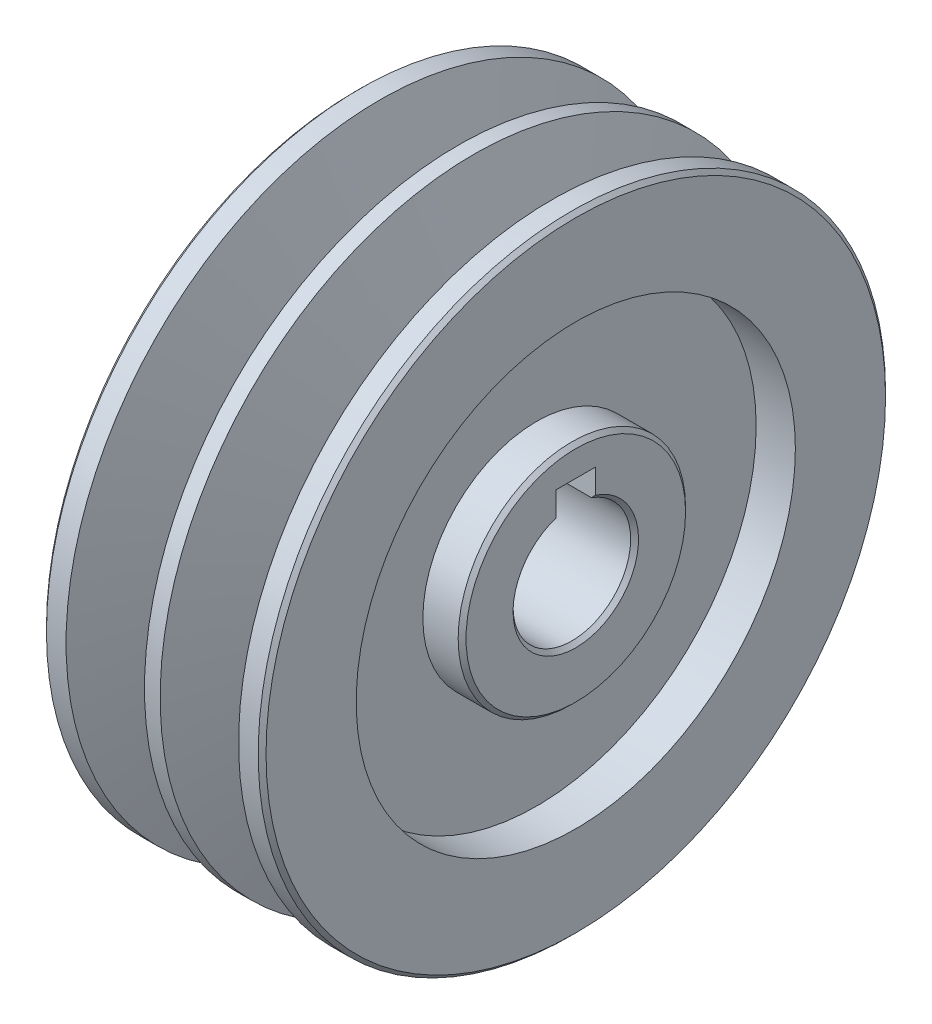
ISO-10303-21;
HEADER;
FILE_DESCRIPTION(('STEP AP214'),'2;1');
FILE_NAME('part.step','',(''),(''),'','','');
FILE_SCHEMA(('AUTOMOTIVE_DESIGN { 1 0 10303 214 1 1 1 1 }'));
ENDSEC;
DATA;
#1=APPLICATION_CONTEXT('core data for automotive mechanical design processes');
#2=APPLICATION_PROTOCOL_DEFINITION('international standard','automotive_design',2000,#1);
#3=PRODUCT_CONTEXT('',#1,'mechanical');
#4=PRODUCT('Part','Part','',(#3));
#5=PRODUCT_RELATED_PRODUCT_CATEGORY('part','',(#4));
#6=PRODUCT_DEFINITION_FORMATION('','',#4);
#7=PRODUCT_DEFINITION_CONTEXT('part definition',#1,'design');
#8=PRODUCT_DEFINITION('design','',#6,#7);
#9=PRODUCT_DEFINITION_SHAPE('','',#8);
#10=(LENGTH_UNIT() NAMED_UNIT(*) SI_UNIT(.MILLI.,.METRE.));
#11=(NAMED_UNIT(*) PLANE_ANGLE_UNIT() SI_UNIT($,.RADIAN.));
#12=(NAMED_UNIT(*) SI_UNIT($,.STERADIAN.) SOLID_ANGLE_UNIT());
#13=UNCERTAINTY_MEASURE_WITH_UNIT(LENGTH_MEASURE(1.E-05),#10,'distance_accuracy_value','');
#14=(GEOMETRIC_REPRESENTATION_CONTEXT(3) GLOBAL_UNCERTAINTY_ASSIGNED_CONTEXT((#13)) GLOBAL_UNIT_ASSIGNED_CONTEXT((#10,
#11,#12)) REPRESENTATION_CONTEXT('',''));
#15=CARTESIAN_POINT('',(0.,0.,0.));
#16=DIRECTION('',(0.,0.,1.));
#17=DIRECTION('',(1.,0.,0.));
#18=AXIS2_PLACEMENT_3D('',#15,#16,#17);
#19=CARTESIAN_POINT('',(0.,0.,0.));
#20=DIRECTION('',(1.,0.,0.));
#21=DIRECTION('',(0.,0.,-1.));
#22=AXIS2_PLACEMENT_3D('',#19,#20,#21);
#23=CYLINDRICAL_SURFACE('',#22,40.);
#24=CARTESIAN_POINT('',(-13.5,0.,0.));
#25=DIRECTION('',(-1.,0.,0.));
#26=DIRECTION('',(0.,0.,1.));
#27=AXIS2_PLACEMENT_3D('',#24,#25,#26);
#28=CIRCLE('',#27,40.);
#29=CARTESIAN_POINT('',(-13.5,0.,40.));
#30=VERTEX_POINT('',#29);
#31=EDGE_CURVE('E313',#30,#30,#28,.F.);
#32=ORIENTED_EDGE('',*,*,#31,.T.);
#33=EDGE_LOOP('',(#32));
#34=FACE_BOUND('',#33,.T.);
#35=CARTESIAN_POINT('',(-11.,0.,0.));
#36=DIRECTION('',(1.,0.,0.));
#37=DIRECTION('',(0.,0.,-1.));
#38=AXIS2_PLACEMENT_3D('',#35,#36,#37);
#39=CIRCLE('',#38,40.);
#40=CARTESIAN_POINT('',(-11.,0.,-40.));
#41=VERTEX_POINT('',#40);
#42=EDGE_CURVE('E563',#41,#41,#39,.T.);
#43=ORIENTED_EDGE('',*,*,#42,.F.);
#44=EDGE_LOOP('',(#43));
#45=FACE_BOUND('',#44,.T.);
#46=ADVANCED_FACE('F36',(#34,#45),#23,.T.);
#47=CARTESIAN_POINT('',(-7.94269318541343,0.,0.));
#48=DIRECTION('',(-1.,0.,0.));
#49=DIRECTION('',(0.,0.,1.));
#50=AXIS2_PLACEMENT_3D('',#47,#48,#49);
#51=CONICAL_SURFACE('',#50,30.,1.27409035395586);
#52=ORIENTED_EDGE('',*,*,#42,.T.);
#53=EDGE_LOOP('',(#52));
#54=FACE_BOUND('',#53,.T.);
#55=CARTESIAN_POINT('',(-7.94269318541343,0.,0.));
#56=DIRECTION('',(1.,0.,0.));
#57=DIRECTION('',(0.,0.,-1.));
#58=AXIS2_PLACEMENT_3D('',#55,#56,#57);
#59=CIRCLE('',#58,30.);
#60=CARTESIAN_POINT('',(-7.94269318541343,0.,-30.));
#61=VERTEX_POINT('',#60);
#62=EDGE_CURVE('E595',#61,#61,#59,.T.);
#63=ORIENTED_EDGE('',*,*,#62,.F.);
#64=EDGE_LOOP('',(#63));
#65=FACE_BOUND('',#64,.T.);
#66=ADVANCED_FACE('F192',(#54,#65),#51,.T.);
#67=CARTESIAN_POINT('',(0.,0.,0.));
#68=DIRECTION('',(1.,0.,0.));
#69=DIRECTION('',(0.,0.,-1.));
#70=AXIS2_PLACEMENT_3D('',#67,#68,#69);
#71=CYLINDRICAL_SURFACE('',#70,30.);
#72=ORIENTED_EDGE('',*,*,#62,.T.);
#73=EDGE_LOOP('',(#72));
#74=FACE_BOUND('',#73,.T.);
#75=CARTESIAN_POINT('',(-4.05730681458657,0.,0.));
#76=DIRECTION('',(1.,0.,0.));
#77=DIRECTION('',(0.,0.,-1.));
#78=AXIS2_PLACEMENT_3D('',#75,#76,#77);
#79=CIRCLE('',#78,30.);
#80=CARTESIAN_POINT('',(-4.05730681458657,0.,-30.));
#81=VERTEX_POINT('',#80);
#82=EDGE_CURVE('E592',#81,#81,#79,.T.);
#83=ORIENTED_EDGE('',*,*,#82,.F.);
#84=EDGE_LOOP('',(#83));
#85=FACE_BOUND('',#84,.T.);
#86=ADVANCED_FACE('F197',(#74,#85),#71,.T.);
#87=CARTESIAN_POINT('',(-1.,0.,0.));
#88=DIRECTION('',(1.,0.,0.));
#89=DIRECTION('',(0.,0.,-1.));
#90=AXIS2_PLACEMENT_3D('',#87,#88,#89);
#91=CONICAL_SURFACE('',#90,40.,1.27409035395586);
#92=ORIENTED_EDGE('',*,*,#82,.T.);
#93=EDGE_LOOP('',(#92));
#94=FACE_BOUND('',#93,.T.);
#95=CARTESIAN_POINT('',(-1.,0.,0.));
#96=DIRECTION('',(1.,0.,0.));
#97=DIRECTION('',(0.,0.,-1.));
#98=AXIS2_PLACEMENT_3D('',#95,#96,#97);
#99=CIRCLE('',#98,40.);
#100=CARTESIAN_POINT('',(-1.,0.,-40.));
#101=VERTEX_POINT('',#100);
#102=EDGE_CURVE('E589',#101,#101,#99,.T.);
#103=ORIENTED_EDGE('',*,*,#102,.F.);
#104=EDGE_LOOP('',(#103));
#105=FACE_BOUND('',#104,.T.);
#106=ADVANCED_FACE('F205',(#94,#105),#91,.T.);
#107=CARTESIAN_POINT('',(0.,0.,0.));
#108=DIRECTION('',(1.,0.,0.));
#109=DIRECTION('',(0.,0.,-1.));
#110=AXIS2_PLACEMENT_3D('',#107,#108,#109);
#111=CYLINDRICAL_SURFACE('',#110,40.);
#112=ORIENTED_EDGE('',*,*,#102,.T.);
#113=EDGE_LOOP('',(#112));
#114=FACE_BOUND('',#113,.T.);
#115=CARTESIAN_POINT('',(1.,0.,0.));
#116=DIRECTION('',(1.,0.,0.));
#117=DIRECTION('',(0.,0.,-1.));
#118=AXIS2_PLACEMENT_3D('',#115,#116,#117);
#119=CIRCLE('',#118,40.);
#120=CARTESIAN_POINT('',(1.,0.,-40.));
#121=VERTEX_POINT('',#120);
#122=EDGE_CURVE('E586',#121,#121,#119,.T.);
#123=ORIENTED_EDGE('',*,*,#122,.F.);
#124=EDGE_LOOP('',(#123));
#125=FACE_BOUND('',#124,.T.);
#126=ADVANCED_FACE('F209',(#114,#125),#111,.T.);
#127=CARTESIAN_POINT('',(4.05730681458657,0.,0.));
#128=DIRECTION('',(-1.,0.,0.));
#129=DIRECTION('',(0.,0.,1.));
#130=AXIS2_PLACEMENT_3D('',#127,#128,#129);
#131=CONICAL_SURFACE('',#130,30.,1.27409035395586);
#132=ORIENTED_EDGE('',*,*,#122,.T.);
#133=EDGE_LOOP('',(#132));
#134=FACE_BOUND('',#133,.T.);
#135=CARTESIAN_POINT('',(4.05730681458657,0.,0.));
#136=DIRECTION('',(1.,0.,0.));
#137=DIRECTION('',(0.,0.,-1.));
#138=AXIS2_PLACEMENT_3D('',#135,#136,#137);
#139=CIRCLE('',#138,30.);
#140=CARTESIAN_POINT('',(4.05730681458657,0.,-30.));
#141=VERTEX_POINT('',#140);
#142=EDGE_CURVE('E583',#141,#141,#139,.T.);
#143=ORIENTED_EDGE('',*,*,#142,.F.);
#144=EDGE_LOOP('',(#143));
#145=FACE_BOUND('',#144,.T.);
#146=ADVANCED_FACE('F213',(#134,#145),#131,.T.);
#147=CARTESIAN_POINT('',(0.,0.,0.));
#148=DIRECTION('',(1.,0.,0.));
#149=DIRECTION('',(0.,0.,-1.));
#150=AXIS2_PLACEMENT_3D('',#147,#148,#149);
#151=CYLINDRICAL_SURFACE('',#150,30.);
#152=ORIENTED_EDGE('',*,*,#142,.T.);
#153=EDGE_LOOP('',(#152));
#154=FACE_BOUND('',#153,.T.);
#155=CARTESIAN_POINT('',(7.94269318541343,0.,0.));
#156=DIRECTION('',(1.,0.,0.));
#157=DIRECTION('',(0.,0.,-1.));
#158=AXIS2_PLACEMENT_3D('',#155,#156,#157);
#159=CIRCLE('',#158,30.);
#160=CARTESIAN_POINT('',(7.94269318541343,0.,-30.));
#161=VERTEX_POINT('',#160);
#162=EDGE_CURVE('E577',#161,#161,#159,.T.);
#163=ORIENTED_EDGE('',*,*,#162,.F.);
#164=EDGE_LOOP('',(#163));
#165=FACE_BOUND('',#164,.T.);
#166=ADVANCED_FACE('F217',(#154,#165),#151,.T.);
#167=CARTESIAN_POINT('',(11.,0.,0.));
#168=DIRECTION('',(1.,0.,0.));
#169=DIRECTION('',(0.,0.,-1.));
#170=AXIS2_PLACEMENT_3D('',#167,#168,#169);
#171=CONICAL_SURFACE('',#170,40.,1.27409035395586);
#172=ORIENTED_EDGE('',*,*,#162,.T.);
#173=EDGE_LOOP('',(#172));
#174=FACE_BOUND('',#173,.T.);
#175=CARTESIAN_POINT('',(11.,0.,0.));
#176=DIRECTION('',(1.,0.,0.));
#177=DIRECTION('',(0.,0.,-1.));
#178=AXIS2_PLACEMENT_3D('',#175,#176,#177);
#179=CIRCLE('',#178,40.);
#180=CARTESIAN_POINT('',(11.,0.,-40.));
#181=VERTEX_POINT('',#180);
#182=EDGE_CURVE('E574',#181,#181,#179,.T.);
#183=ORIENTED_EDGE('',*,*,#182,.F.);
#184=EDGE_LOOP('',(#183));
#185=FACE_BOUND('',#184,.T.);
#186=ADVANCED_FACE('F221',(#174,#185),#171,.T.);
#187=CARTESIAN_POINT('',(0.,0.,0.));
#188=DIRECTION('',(1.,0.,0.));
#189=DIRECTION('',(0.,0.,-1.));
#190=AXIS2_PLACEMENT_3D('',#187,#188,#189);
#191=CYLINDRICAL_SURFACE('',#190,40.);
#192=CARTESIAN_POINT('',(13.5,0.,0.));
#193=DIRECTION('',(1.,0.,0.));
#194=DIRECTION('',(0.,0.,-1.));
#195=AXIS2_PLACEMENT_3D('',#192,#193,#194);
#196=CIRCLE('',#195,40.);
#197=CARTESIAN_POINT('',(13.5,0.,-40.));
#198=VERTEX_POINT('',#197);
#199=EDGE_CURVE('E299',#198,#198,#196,.F.);
#200=ORIENTED_EDGE('',*,*,#199,.T.);
#201=EDGE_LOOP('',(#200));
#202=FACE_BOUND('',#201,.T.);
#203=ORIENTED_EDGE('',*,*,#182,.T.);
#204=EDGE_LOOP('',(#203));
#205=FACE_BOUND('',#204,.T.);
#206=ADVANCED_FACE('F225',(#202,#205),#191,.T.);
#207=CARTESIAN_POINT('',(14.,0.,-40.));
#208=DIRECTION('',(1.,0.,0.));
#209=DIRECTION('',(0.,0.,-1.));
#210=AXIS2_PLACEMENT_3D('',#207,#208,#209);
#211=PLANE('',#210);
#212=CARTESIAN_POINT('',(14.,0.,0.));
#213=DIRECTION('',(1.,0.,0.));
#214=DIRECTION('',(0.,0.,-1.));
#215=AXIS2_PLACEMENT_3D('',#212,#213,#214);
#216=CIRCLE('',#215,39.5);
#217=CARTESIAN_POINT('',(14.,0.,-39.5));
#218=VERTEX_POINT('',#217);
#219=EDGE_CURVE('E304',#218,#218,#216,.T.);
#220=ORIENTED_EDGE('',*,*,#219,.T.);
#221=EDGE_LOOP('',(#220));
#222=FACE_BOUND('',#221,.T.);
#223=CARTESIAN_POINT('',(14.,0.,0.));
#224=DIRECTION('',(1.,0.,0.));
#225=DIRECTION('',(0.,0.,-1.));
#226=AXIS2_PLACEMENT_3D('',#223,#224,#225);
#227=CIRCLE('',#226,28.);
#228=CARTESIAN_POINT('',(14.,0.,-28.));
#229=VERTEX_POINT('',#228);
#230=EDGE_CURVE('E573',#229,#229,#227,.T.);
#231=ORIENTED_EDGE('',*,*,#230,.F.);
#232=EDGE_LOOP('',(#231));
#233=FACE_BOUND('',#232,.T.);
#234=ADVANCED_FACE('F229',(#222,#233),#211,.T.);
#235=CARTESIAN_POINT('',(0.,0.,0.));
#236=DIRECTION('',(1.,0.,0.));
#237=DIRECTION('',(0.,0.,-1.));
#238=AXIS2_PLACEMENT_3D('',#235,#236,#237);
#239=CYLINDRICAL_SURFACE('',#238,28.);
#240=ORIENTED_EDGE('',*,*,#230,.T.);
#241=EDGE_LOOP('',(#240));
#242=FACE_BOUND('',#241,.T.);
#243=CARTESIAN_POINT('',(9.,0.,0.));
#244=DIRECTION('',(1.,0.,0.));
#245=DIRECTION('',(0.,0.,-1.));
#246=AXIS2_PLACEMENT_3D('',#243,#244,#245);
#247=CIRCLE('',#246,28.);
#248=CARTESIAN_POINT('',(9.,0.,-28.));
#249=VERTEX_POINT('',#248);
#250=EDGE_CURVE('E327',#249,#249,#247,.T.);
#251=ORIENTED_EDGE('',*,*,#250,.F.);
#252=EDGE_LOOP('',(#251));
#253=FACE_BOUND('',#252,.T.);
#254=ADVANCED_FACE('F233',(#242,#253),#239,.F.);
#255=CARTESIAN_POINT('',(9.,0.,-28.));
#256=DIRECTION('',(1.,0.,0.));
#257=DIRECTION('',(0.,0.,-1.));
#258=AXIS2_PLACEMENT_3D('',#255,#256,#257);
#259=PLANE('',#258);
#260=ORIENTED_EDGE('',*,*,#250,.T.);
#261=EDGE_LOOP('',(#260));
#262=FACE_BOUND('',#261,.T.);
#263=CARTESIAN_POINT('',(9.,0.,0.));
#264=DIRECTION('',(1.,0.,0.));
#265=DIRECTION('',(0.,0.,-1.));
#266=AXIS2_PLACEMENT_3D('',#263,#264,#265);
#267=CIRCLE('',#266,14.5);
#268=CARTESIAN_POINT('',(9.,0.,-14.5));
#269=VERTEX_POINT('',#268);
#270=EDGE_CURVE('E325',#269,#269,#267,.T.);
#271=ORIENTED_EDGE('',*,*,#270,.F.);
#272=EDGE_LOOP('',(#271));
#273=FACE_BOUND('',#272,.T.);
#274=ADVANCED_FACE('F237',(#262,#273),#259,.T.);
#275=CARTESIAN_POINT('',(0.,0.,0.));
#276=DIRECTION('',(1.,0.,0.));
#277=DIRECTION('',(0.,0.,-1.));
#278=AXIS2_PLACEMENT_3D('',#275,#276,#277);
#279=CYLINDRICAL_SURFACE('',#278,14.5);
#280=CARTESIAN_POINT('',(13.5,0.,0.));
#281=DIRECTION('',(1.,0.,0.));
#282=DIRECTION('',(0.,0.,-1.));
#283=AXIS2_PLACEMENT_3D('',#280,#281,#282);
#284=CIRCLE('',#283,14.5);
#285=CARTESIAN_POINT('',(13.5,0.,-14.5));
#286=VERTEX_POINT('',#285);
#287=EDGE_CURVE('E553',#286,#286,#284,.F.);
#288=ORIENTED_EDGE('',*,*,#287,.T.);
#289=EDGE_LOOP('',(#288));
#290=FACE_BOUND('',#289,.T.);
#291=ORIENTED_EDGE('',*,*,#270,.T.);
#292=EDGE_LOOP('',(#291));
#293=FACE_BOUND('',#292,.T.);
#294=ADVANCED_FACE('F241',(#290,#293),#279,.T.);
#295=CARTESIAN_POINT('',(14.,0.,-14.5));
#296=DIRECTION('',(1.,0.,0.));
#297=DIRECTION('',(0.,0.,-1.));
#298=AXIS2_PLACEMENT_3D('',#295,#296,#297);
#299=PLANE('',#298);
#300=DIRECTION('',(0.,-1.,0.));
#301=VECTOR('',#300,1.);
#302=CARTESIAN_POINT('',(14.,7.5,2.5));
#303=LINE('',#302,#301);
#304=CARTESIAN_POINT('',(14.,10.7,2.5));
#305=VERTEX_POINT('',#304);
#306=CARTESIAN_POINT('',(14.,7.59934207678532,2.5));
#307=VERTEX_POINT('',#306);
#308=EDGE_CURVE('E115',#305,#307,#303,.T.);
#309=ORIENTED_EDGE('',*,*,#308,.F.);
#310=DIRECTION('',(0.,0.,1.));
#311=VECTOR('',#310,1.);
#312=CARTESIAN_POINT('',(14.,10.7,2.5));
#313=LINE('',#312,#311);
#314=CARTESIAN_POINT('',(14.,10.7,-2.5));
#315=VERTEX_POINT('',#314);
#316=EDGE_CURVE('E117',#315,#305,#313,.T.);
#317=ORIENTED_EDGE('',*,*,#316,.F.);
#318=DIRECTION('',(0.,1.,0.));
#319=VECTOR('',#318,1.);
#320=CARTESIAN_POINT('',(14.,10.7,-2.5));
#321=LINE('',#320,#319);
#322=CARTESIAN_POINT('',(14.,7.59934207678532,-2.5));
#323=VERTEX_POINT('',#322);
#324=EDGE_CURVE('E96',#323,#315,#321,.T.);
#325=ORIENTED_EDGE('',*,*,#324,.F.);
#326=CARTESIAN_POINT('',(14.,0.,0.));
#327=DIRECTION('',(1.,0.,0.));
#328=DIRECTION('',(0.,0.,-1.));
#329=AXIS2_PLACEMENT_3D('',#326,#327,#328);
#330=CIRCLE('',#329,7.99999999999999);
#331=EDGE_CURVE('E558',#323,#307,#330,.F.);
#332=ORIENTED_EDGE('',*,*,#331,.T.);
#333=EDGE_LOOP('',(#309,#317,#325,#332));
#334=FACE_BOUND('',#333,.T.);
#335=CARTESIAN_POINT('',(14.,0.,0.));
#336=DIRECTION('',(1.,0.,0.));
#337=DIRECTION('',(0.,0.,-1.));
#338=AXIS2_PLACEMENT_3D('',#335,#336,#337);
#339=CIRCLE('',#338,14.);
#340=CARTESIAN_POINT('',(14.,0.,-14.));
#341=VERTEX_POINT('',#340);
#342=EDGE_CURVE('E556',#341,#341,#339,.T.);
#343=ORIENTED_EDGE('',*,*,#342,.T.);
#344=EDGE_LOOP('',(#343));
#345=FACE_BOUND('',#344,.T.);
#346=ADVANCED_FACE('F245',(#334,#345),#299,.T.);
#347=CARTESIAN_POINT('',(0.,0.,0.));
#348=DIRECTION('',(1.,0.,0.));
#349=DIRECTION('',(0.,0.,-1.));
#350=AXIS2_PLACEMENT_3D('',#347,#348,#349);
#351=CYLINDRICAL_SURFACE('',#350,7.5);
#352=DIRECTION('',(1.,0.,0.));
#353=VECTOR('',#352,1.);
#354=CARTESIAN_POINT('',(0.,7.07106781186547,2.5));
#355=LINE('',#354,#353);
#356=CARTESIAN_POINT('',(13.5,7.07106781186547,2.5));
#357=VERTEX_POINT('',#356);
#358=CARTESIAN_POINT('',(-13.5,7.07106781186548,2.5));
#359=VERTEX_POINT('',#358);
#360=EDGE_CURVE('E134',#357,#359,#355,.F.);
#361=ORIENTED_EDGE('',*,*,#360,.F.);
#362=CARTESIAN_POINT('',(13.5,0.,0.));
#363=DIRECTION('',(1.,0.,0.));
#364=DIRECTION('',(0.,0.,-1.));
#365=AXIS2_PLACEMENT_3D('',#362,#363,#364);
#366=CIRCLE('',#365,7.5);
#367=CARTESIAN_POINT('',(13.5,7.07106781186547,-2.5));
#368=VERTEX_POINT('',#367);
#369=EDGE_CURVE('E559',#357,#368,#366,.T.);
#370=ORIENTED_EDGE('',*,*,#369,.T.);
#371=DIRECTION('',(1.,0.,0.));
#372=VECTOR('',#371,1.);
#373=CARTESIAN_POINT('',(0.,7.07106781186547,-2.5));
#374=LINE('',#373,#372);
#375=CARTESIAN_POINT('',(-13.5,7.07106781186547,-2.5));
#376=VERTEX_POINT('',#375);
#377=EDGE_CURVE('E123',#376,#368,#374,.T.);
#378=ORIENTED_EDGE('',*,*,#377,.F.);
#379=CARTESIAN_POINT('',(-13.5,0.,0.));
#380=DIRECTION('',(-1.,0.,0.));
#381=DIRECTION('',(0.,0.,1.));
#382=AXIS2_PLACEMENT_3D('',#379,#380,#381);
#383=CIRCLE('',#382,7.5);
#384=EDGE_CURVE('E310',#376,#359,#383,.T.);
#385=ORIENTED_EDGE('',*,*,#384,.T.);
#386=EDGE_LOOP('',(#361,#370,#378,#385));
#387=FACE_BOUND('',#386,.T.);
#388=ADVANCED_FACE('F249',(#387),#351,.F.);
#389=CARTESIAN_POINT('',(-14.,0.,-7.5));
#390=DIRECTION('',(-1.,0.,0.));
#391=DIRECTION('',(0.,0.,1.));
#392=AXIS2_PLACEMENT_3D('',#389,#390,#391);
#393=PLANE('',#392);
#394=DIRECTION('',(0.,-1.,0.));
#395=VECTOR('',#394,1.);
#396=CARTESIAN_POINT('',(-14.,10.7,2.5));
#397=LINE('',#396,#395);
#398=CARTESIAN_POINT('',(-14.,10.7,2.5));
#399=VERTEX_POINT('',#398);
#400=CARTESIAN_POINT('',(-14.,7.59934207678531,2.5));
#401=VERTEX_POINT('',#400);
#402=EDGE_CURVE('E101',#399,#401,#397,.T.);
#403=ORIENTED_EDGE('',*,*,#402,.T.);
#404=CARTESIAN_POINT('',(-14.,0.,0.));
#405=DIRECTION('',(-1.,0.,0.));
#406=DIRECTION('',(0.,0.,1.));
#407=AXIS2_PLACEMENT_3D('',#404,#405,#406);
#408=CIRCLE('',#407,7.99999999999998);
#409=CARTESIAN_POINT('',(-14.,7.59934207678531,-2.5));
#410=VERTEX_POINT('',#409);
#411=EDGE_CURVE('E114',#401,#410,#408,.F.);
#412=ORIENTED_EDGE('',*,*,#411,.T.);
#413=DIRECTION('',(0.,1.,0.));
#414=VECTOR('',#413,1.);
#415=CARTESIAN_POINT('',(-14.,5.83298087794207,-2.5));
#416=LINE('',#415,#414);
#417=CARTESIAN_POINT('',(-14.,10.7,-2.5));
#418=VERTEX_POINT('',#417);
#419=EDGE_CURVE('E57',#410,#418,#416,.T.);
#420=ORIENTED_EDGE('',*,*,#419,.T.);
#421=DIRECTION('',(0.,0.,1.));
#422=VECTOR('',#421,1.);
#423=CARTESIAN_POINT('',(-14.,10.7,2.5));
#424=LINE('',#423,#422);
#425=EDGE_CURVE('E104',#418,#399,#424,.T.);
#426=ORIENTED_EDGE('',*,*,#425,.T.);
#427=EDGE_LOOP('',(#403,#412,#420,#426));
#428=FACE_BOUND('',#427,.T.);
#429=CARTESIAN_POINT('',(-14.,0.,0.));
#430=DIRECTION('',(-1.,0.,0.));
#431=DIRECTION('',(0.,0.,1.));
#432=AXIS2_PLACEMENT_3D('',#429,#430,#431);
#433=CIRCLE('',#432,14.);
#434=CARTESIAN_POINT('',(-14.,0.,14.));
#435=VERTEX_POINT('',#434);
#436=EDGE_CURVE('E301',#435,#435,#433,.T.);
#437=ORIENTED_EDGE('',*,*,#436,.T.);
#438=EDGE_LOOP('',(#437));
#439=FACE_BOUND('',#438,.T.);
#440=ADVANCED_FACE('F111',(#428,#439),#393,.T.);
#441=CARTESIAN_POINT('',(0.,0.,0.));
#442=DIRECTION('',(1.,0.,0.));
#443=DIRECTION('',(0.,0.,-1.));
#444=AXIS2_PLACEMENT_3D('',#441,#442,#443);
#445=CYLINDRICAL_SURFACE('',#444,14.5);
#446=CARTESIAN_POINT('',(-10.,0.,0.));
#447=DIRECTION('',(-1.,0.,0.));
#448=DIRECTION('',(0.,0.,1.));
#449=AXIS2_PLACEMENT_3D('',#446,#447,#448);
#450=CIRCLE('',#449,14.5);
#451=CARTESIAN_POINT('',(-10.,0.,14.5));
#452=VERTEX_POINT('',#451);
#453=EDGE_CURVE('E153',#452,#452,#450,.T.);
#454=ORIENTED_EDGE('',*,*,#453,.T.);
#455=EDGE_LOOP('',(#454));
#456=FACE_BOUND('',#455,.T.);
#457=CARTESIAN_POINT('',(-13.5,0.,0.));
#458=DIRECTION('',(-1.,0.,0.));
#459=DIRECTION('',(0.,0.,1.));
#460=AXIS2_PLACEMENT_3D('',#457,#458,#459);
#461=CIRCLE('',#460,14.5);
#462=CARTESIAN_POINT('',(-13.5,0.,14.5));
#463=VERTEX_POINT('',#462);
#464=EDGE_CURVE('E297',#463,#463,#461,.F.);
#465=ORIENTED_EDGE('',*,*,#464,.T.);
#466=EDGE_LOOP('',(#465));
#467=FACE_BOUND('',#466,.T.);
#468=ADVANCED_FACE('F256',(#456,#467),#445,.T.);
#469=CARTESIAN_POINT('',(-9.,0.,-14.5));
#470=DIRECTION('',(-1.,0.,0.));
#471=DIRECTION('',(0.,0.,1.));
#472=AXIS2_PLACEMENT_3D('',#469,#470,#471);
#473=PLANE('',#472);
#474=CARTESIAN_POINT('',(-9.,0.,0.));
#475=DIRECTION('',(-1.,0.,0.));
#476=DIRECTION('',(0.,0.,1.));
#477=AXIS2_PLACEMENT_3D('',#474,#475,#476);
#478=CIRCLE('',#477,27.);
#479=CARTESIAN_POINT('',(-9.,0.,27.));
#480=VERTEX_POINT('',#479);
#481=EDGE_CURVE('E287',#480,#480,#478,.T.);
#482=ORIENTED_EDGE('',*,*,#481,.T.);
#483=EDGE_LOOP('',(#482));
#484=FACE_BOUND('',#483,.T.);
#485=CARTESIAN_POINT('',(-9.,0.,0.));
#486=DIRECTION('',(-1.,0.,0.));
#487=DIRECTION('',(0.,0.,1.));
#488=AXIS2_PLACEMENT_3D('',#485,#486,#487);
#489=CIRCLE('',#488,15.5);
#490=CARTESIAN_POINT('',(-9.,0.,15.5));
#491=VERTEX_POINT('',#490);
#492=EDGE_CURVE('E279',#491,#491,#489,.F.);
#493=ORIENTED_EDGE('',*,*,#492,.T.);
#494=EDGE_LOOP('',(#493));
#495=FACE_BOUND('',#494,.T.);
#496=ADVANCED_FACE('F259',(#484,#495),#473,.T.);
#497=CARTESIAN_POINT('',(0.,0.,0.));
#498=DIRECTION('',(1.,0.,0.));
#499=DIRECTION('',(0.,0.,-1.));
#500=AXIS2_PLACEMENT_3D('',#497,#498,#499);
#501=CYLINDRICAL_SURFACE('',#500,28.);
#502=CARTESIAN_POINT('',(-10.,0.,0.));
#503=DIRECTION('',(-1.,0.,0.));
#504=DIRECTION('',(0.,0.,1.));
#505=AXIS2_PLACEMENT_3D('',#502,#503,#504);
#506=CIRCLE('',#505,28.);
#507=CARTESIAN_POINT('',(-10.,0.,28.));
#508=VERTEX_POINT('',#507);
#509=EDGE_CURVE('E273',#508,#508,#506,.F.);
#510=ORIENTED_EDGE('',*,*,#509,.T.);
#511=EDGE_LOOP('',(#510));
#512=FACE_BOUND('',#511,.T.);
#513=CARTESIAN_POINT('',(-13.5,0.,0.));
#514=DIRECTION('',(-1.,0.,0.));
#515=DIRECTION('',(0.,0.,1.));
#516=AXIS2_PLACEMENT_3D('',#513,#514,#515);
#517=CIRCLE('',#516,28.);
#518=CARTESIAN_POINT('',(-13.5,0.,28.));
#519=VERTEX_POINT('',#518);
#520=EDGE_CURVE('E276',#519,#519,#517,.T.);
#521=ORIENTED_EDGE('',*,*,#520,.T.);
#522=EDGE_LOOP('',(#521));
#523=FACE_BOUND('',#522,.T.);
#524=ADVANCED_FACE('F262',(#512,#523),#501,.F.);
#525=CARTESIAN_POINT('',(-14.,0.,-40.));
#526=DIRECTION('',(-1.,0.,0.));
#527=DIRECTION('',(0.,0.,1.));
#528=AXIS2_PLACEMENT_3D('',#525,#526,#527);
#529=PLANE('',#528);
#530=CARTESIAN_POINT('',(-14.,0.,0.));
#531=DIRECTION('',(-1.,0.,0.));
#532=DIRECTION('',(0.,0.,1.));
#533=AXIS2_PLACEMENT_3D('',#530,#531,#532);
#534=CIRCLE('',#533,39.5);
#535=CARTESIAN_POINT('',(-14.,0.,39.5));
#536=VERTEX_POINT('',#535);
#537=EDGE_CURVE('E277',#536,#536,#534,.T.);
#538=ORIENTED_EDGE('',*,*,#537,.T.);
#539=EDGE_LOOP('',(#538));
#540=FACE_BOUND('',#539,.T.);
#541=CARTESIAN_POINT('',(-14.,0.,0.));
#542=DIRECTION('',(-1.,0.,0.));
#543=DIRECTION('',(0.,0.,1.));
#544=AXIS2_PLACEMENT_3D('',#541,#542,#543);
#545=CIRCLE('',#544,28.5);
#546=CARTESIAN_POINT('',(-14.,0.,28.5));
#547=VERTEX_POINT('',#546);
#548=EDGE_CURVE('E282',#547,#547,#545,.F.);
#549=ORIENTED_EDGE('',*,*,#548,.T.);
#550=EDGE_LOOP('',(#549));
#551=FACE_BOUND('',#550,.T.);
#552=ADVANCED_FACE('F145',(#540,#551),#529,.T.);
#553=CARTESIAN_POINT('',(13.5,0.,0.));
#554=DIRECTION('',(1.,0.,0.));
#555=DIRECTION('',(0.,0.,-1.));
#556=AXIS2_PLACEMENT_3D('',#553,#554,#555);
#557=CONICAL_SURFACE('',#556,7.5,0.785398163397464);
#558=CARTESIAN_POINT('',(16.2241541081966,9.9137947945353,2.5));
#559=CARTESIAN_POINT('',(16.0145033710386,9.697577583838,2.5));
#560=CARTESIAN_POINT('',(15.8050597434315,9.48115999265697,2.5));
#561=CARTESIAN_POINT('',(15.3866907408756,9.04782504841005,2.5));
#562=CARTESIAN_POINT('',(15.1777653652926,8.83090769595636,2.5));
#563=CARTESIAN_POINT('',(14.5519698666039,8.1793066485935,2.5));
#564=CARTESIAN_POINT('',(14.1360321161034,7.74372429165642,2.5));
#565=CARTESIAN_POINT('',(13.5151294679746,7.0874608379263,2.5));
#566=CARTESIAN_POINT('',(13.3086510652098,6.86821230088805,2.5));
#567=CARTESIAN_POINT('',(12.8970371710727,6.42846315838846,2.5));
#568=CARTESIAN_POINT('',(12.6919016599112,6.20796257146756,2.5));
#569=CARTESIAN_POINT('',(12.283400043912,5.7652765187079,2.5));
#570=CARTESIAN_POINT('',(12.080034149573,5.54309085815472,2.5));
#571=CARTESIAN_POINT('',(11.7768599693935,5.20810499162334,2.5));
#572=CARTESIAN_POINT('',(11.6761118613181,5.09615565759617,2.5));
#573=CARTESIAN_POINT('',(11.4753752313372,4.8715754973667,2.5));
#574=CARTESIAN_POINT('',(11.375386720041,4.75894466168522,2.5));
#575=CARTESIAN_POINT('',(11.2758458918035,4.64591754921019,2.5));
#576=B_SPLINE_CURVE_WITH_KNOTS('',3,(#558,#559,#560,#561,#562,#563,#564,#565,#566,#567,#568,
#569,#570,#571,#572,#573,#574,#575),.UNSPECIFIED.,.F.,.F.,(4,2,2,2,2,2,2,2,4),(0.,
0.903508776760615,1.80701644735533,3.61382403291251,4.51732935603926,5.42082133470234,
6.32441935496883,6.77624092327531,7.22806879059224),.UNSPECIFIED.);
#577=EDGE_CURVE('E65',#307,#357,#576,.T.);
#578=ORIENTED_EDGE('',*,*,#577,.F.);
#579=ORIENTED_EDGE('',*,*,#331,.F.);
#580=CARTESIAN_POINT('',(11.2758458918034,4.64591754921003,-2.5));
#581=CARTESIAN_POINT('',(11.3610104475229,4.74262373536472,-2.5));
#582=CARTESIAN_POINT('',(11.4465048147091,4.83903828660195,-2.5));
#583=CARTESIAN_POINT('',(11.6180644839162,5.03135652637506,-2.5));
#584=CARTESIAN_POINT('',(11.7041297802893,5.12726021994767,-2.5));
#585=CARTESIAN_POINT('',(11.9630448559035,5.41430903678419,-2.5));
#586=CARTESIAN_POINT('',(12.1366204588605,5.60479940594472,-2.5));
#587=CARTESIAN_POINT('',(12.4851998593603,5.98443474250245,-2.5));
#588=CARTESIAN_POINT('',(12.660203527453,6.17357982899956,-2.5));
#589=CARTESIAN_POINT('',(13.0113263925264,6.55083490623167,-2.5));
#590=CARTESIAN_POINT('',(13.1874456021571,6.73894488518342,-2.5));
#591=CARTESIAN_POINT('',(13.7170496849856,7.30200080217481,-2.5));
#592=CARTESIAN_POINT('',(14.0718309399795,7.67572679152401,-2.5));
#593=CARTESIAN_POINT('',(14.783625468035,8.42105582953006,-2.5));
#594=CARTESIAN_POINT('',(15.1406387841444,8.79265883697681,-2.5));
#595=CARTESIAN_POINT('',(15.619213095999,9.2887206234677,-2.5));
#596=CARTESIAN_POINT('',(15.7400907990127,9.41383929340664,-2.5));
#597=CARTESIAN_POINT('',(15.9820069418375,9.66392628100273,-2.5));
#598=CARTESIAN_POINT('',(16.1030453849981,9.78889459541977,-2.5));
#599=CARTESIAN_POINT('',(16.2241541081966,9.9137947945353,-2.5));
#600=B_SPLINE_CURVE_WITH_KNOTS('',3,(#580,#581,#582,#583,#584,#585,#586,#587,#588,#589,#590,
#591,#592,#593,#594,#595,#596,#597,#598,#599),.UNSPECIFIED.,.F.,.F.,(4,2,2,2,2,2,2,2,2,4),(0.,
0.386580087731214,0.773156356955514,1.54627882967222,2.31933198274439,3.0923939178149,
4.63829700781021,6.18423000471782,6.70614456933829,7.22807018644543),.UNSPECIFIED.);
#601=EDGE_CURVE('E126',#368,#323,#600,.T.);
#602=ORIENTED_EDGE('',*,*,#601,.F.);
#603=ORIENTED_EDGE('',*,*,#369,.F.);
#604=EDGE_LOOP('',(#578,#579,#602,#603));
#605=FACE_BOUND('',#604,.T.);
#606=ADVANCED_FACE('F137',(#605),#557,.F.);
#607=CARTESIAN_POINT('',(14.,0.,0.));
#608=DIRECTION('',(-1.,0.,0.));
#609=DIRECTION('',(0.,0.,1.));
#610=AXIS2_PLACEMENT_3D('',#607,#608,#609);
#611=CONICAL_SURFACE('',#610,14.,0.785398163397469);
#612=ORIENTED_EDGE('',*,*,#287,.F.);
#613=EDGE_LOOP('',(#612));
#614=FACE_BOUND('',#613,.T.);
#615=ORIENTED_EDGE('',*,*,#342,.F.);
#616=EDGE_LOOP('',(#615));
#617=FACE_BOUND('',#616,.T.);
#618=ADVANCED_FACE('F377',(#614,#617),#611,.T.);
#619=CARTESIAN_POINT('',(14.,0.,0.));
#620=DIRECTION('',(-1.,0.,0.));
#621=DIRECTION('',(0.,0.,1.));
#622=AXIS2_PLACEMENT_3D('',#619,#620,#621);
#623=CONICAL_SURFACE('',#622,39.5,0.785398163397462);
#624=ORIENTED_EDGE('',*,*,#199,.F.);
#625=EDGE_LOOP('',(#624));
#626=FACE_BOUND('',#625,.T.);
#627=ORIENTED_EDGE('',*,*,#219,.F.);
#628=EDGE_LOOP('',(#627));
#629=FACE_BOUND('',#628,.T.);
#630=ADVANCED_FACE('F442',(#626,#629),#623,.T.);
#631=CARTESIAN_POINT('',(-13.5,0.,0.));
#632=DIRECTION('',(1.,0.,0.));
#633=DIRECTION('',(0.,0.,-1.));
#634=AXIS2_PLACEMENT_3D('',#631,#632,#633);
#635=CONICAL_SURFACE('',#634,14.5,0.785398163397457);
#636=ORIENTED_EDGE('',*,*,#436,.F.);
#637=EDGE_LOOP('',(#636));
#638=FACE_BOUND('',#637,.T.);
#639=ORIENTED_EDGE('',*,*,#464,.F.);
#640=EDGE_LOOP('',(#639));
#641=FACE_BOUND('',#640,.T.);
#642=ADVANCED_FACE('F166',(#638,#641),#635,.T.);
#643=CARTESIAN_POINT('',(-14.,0.,0.));
#644=DIRECTION('',(-1.,0.,0.));
#645=DIRECTION('',(0.,0.,1.));
#646=AXIS2_PLACEMENT_3D('',#643,#644,#645);
#647=CONICAL_SURFACE('',#646,7.99999999999998,0.785398163397447);
#648=CARTESIAN_POINT('',(-11.2758458918035,4.64591754921029,2.5));
#649=CARTESIAN_POINT('',(-11.3610104475231,4.74262373536498,2.5));
#650=CARTESIAN_POINT('',(-11.4465048147093,4.83903828660221,2.5));
#651=CARTESIAN_POINT('',(-11.6180644839164,5.03135652637533,2.5));
#652=CARTESIAN_POINT('',(-11.7041297802894,5.12726021994794,2.5));
#653=CARTESIAN_POINT('',(-11.9630448559037,5.41430903678448,2.5));
#654=CARTESIAN_POINT('',(-12.1366204588607,5.60479940594501,2.5));
#655=CARTESIAN_POINT('',(-12.4851998593606,5.98443474250275,2.5));
#656=CARTESIAN_POINT('',(-12.6602035274533,6.17357982899987,2.5));
#657=CARTESIAN_POINT('',(-13.0113263925267,6.55083490623199,2.5));
#658=CARTESIAN_POINT('',(-13.1874456021574,6.73894488518375,2.5));
#659=CARTESIAN_POINT('',(-13.717049684986,7.30200080217515,2.5));
#660=CARTESIAN_POINT('',(-14.0718309399798,7.67572679152436,2.5));
#661=CARTESIAN_POINT('',(-14.7836254680354,8.42105582953043,2.5));
#662=CARTESIAN_POINT('',(-15.1406387841448,8.79265883697719,2.5));
#663=CARTESIAN_POINT('',(-15.6192130959993,9.28872062346801,2.5));
#664=CARTESIAN_POINT('',(-15.740090799013,9.41383929340688,2.5));
#665=CARTESIAN_POINT('',(-15.9820069418376,9.66392628100279,2.5));
#666=CARTESIAN_POINT('',(-16.1030453849982,9.78889459541974,2.5));
#667=CARTESIAN_POINT('',(-16.2241541081966,9.9137947945352,2.5));
#668=B_SPLINE_CURVE_WITH_KNOTS('',3,(#648,#649,#650,#651,#652,#653,#654,#655,#656,#657,#658,
#659,#660,#661,#662,#663,#664,#665,#666,#667),.UNSPECIFIED.,.F.,.F.,(4,2,2,2,2,2,2,2,2,4),(0.,
0.386580087731236,0.773156356955553,1.5462788296723,2.31933198274451,3.09239391781506,
4.63829700781044,6.18423000471813,6.70614456933826,7.22807018644505),.UNSPECIFIED.);
#669=EDGE_CURVE('E11',#359,#401,#668,.T.);
#670=ORIENTED_EDGE('',*,*,#669,.F.);
#671=ORIENTED_EDGE('',*,*,#384,.F.);
#672=CARTESIAN_POINT('',(-16.2241541081966,9.9137947945352,-2.5));
#673=CARTESIAN_POINT('',(-16.0145033710386,9.69757758383789,-2.5));
#674=CARTESIAN_POINT('',(-15.8050597434315,9.48115999265686,-2.5));
#675=CARTESIAN_POINT('',(-15.3866907408756,9.04782504840996,-2.5));
#676=CARTESIAN_POINT('',(-15.1777653652926,8.83090769595626,-2.5));
#677=CARTESIAN_POINT('',(-14.5519698666039,8.17930664859342,-2.5));
#678=CARTESIAN_POINT('',(-14.1360321161033,7.74372429165634,-2.5));
#679=CARTESIAN_POINT('',(-13.5151294679745,7.08746083792623,-2.5));
#680=CARTESIAN_POINT('',(-13.3086510652097,6.86821230088798,-2.5));
#681=CARTESIAN_POINT('',(-12.8970371710727,6.42846315838839,-2.5));
#682=CARTESIAN_POINT('',(-12.6919016599111,6.2079625714675,-2.5));
#683=CARTESIAN_POINT('',(-12.2834000439119,5.76527651870784,-2.5));
#684=CARTESIAN_POINT('',(-12.0800341495729,5.54309085815466,-2.5));
#685=CARTESIAN_POINT('',(-11.7768599693933,5.20810499162328,-2.5));
#686=CARTESIAN_POINT('',(-11.6761118613179,5.09615565759611,-2.5));
#687=CARTESIAN_POINT('',(-11.4753752313371,4.87157549736664,-2.5));
#688=CARTESIAN_POINT('',(-11.3753867200408,4.75894466168516,-2.5));
#689=CARTESIAN_POINT('',(-11.2758458918034,4.64591754921013,-2.5));
#690=B_SPLINE_CURVE_WITH_KNOTS('',3,(#672,#673,#674,#675,#676,#677,#678,#679,#680,#681,#682,
#683,#684,#685,#686,#687,#688,#689),.UNSPECIFIED.,.F.,.F.,(4,2,2,2,2,2,2,2,4),(0.,
0.903508776760618,1.80701644735534,3.61382403291253,4.51732935603928,5.42082133470237,
6.32441935496886,6.77624092327534,7.22806879059228),.UNSPECIFIED.);
#691=EDGE_CURVE('E50',#410,#376,#690,.T.);
#692=ORIENTED_EDGE('',*,*,#691,.F.);
#693=ORIENTED_EDGE('',*,*,#411,.F.);
#694=EDGE_LOOP('',(#670,#671,#692,#693));
#695=FACE_BOUND('',#694,.T.);
#696=ADVANCED_FACE('F156',(#695),#647,.F.);
#697=CARTESIAN_POINT('',(-13.5,0.,0.));
#698=DIRECTION('',(1.,0.,0.));
#699=DIRECTION('',(0.,0.,-1.));
#700=AXIS2_PLACEMENT_3D('',#697,#698,#699);
#701=CONICAL_SURFACE('',#700,40.,0.785398163397455);
#702=ORIENTED_EDGE('',*,*,#537,.F.);
#703=EDGE_LOOP('',(#702));
#704=FACE_BOUND('',#703,.T.);
#705=ORIENTED_EDGE('',*,*,#31,.F.);
#706=EDGE_LOOP('',(#705));
#707=FACE_BOUND('',#706,.T.);
#708=ADVANCED_FACE('F165',(#704,#707),#701,.T.);
#709=CARTESIAN_POINT('',(-14.,0.,0.));
#710=DIRECTION('',(-1.,0.,0.));
#711=DIRECTION('',(0.,0.,1.));
#712=AXIS2_PLACEMENT_3D('',#709,#710,#711);
#713=CONICAL_SURFACE('',#712,28.5,0.785398163397441);
#714=ORIENTED_EDGE('',*,*,#520,.F.);
#715=EDGE_LOOP('',(#714));
#716=FACE_BOUND('',#715,.T.);
#717=ORIENTED_EDGE('',*,*,#548,.F.);
#718=EDGE_LOOP('',(#717));
#719=FACE_BOUND('',#718,.T.);
#720=ADVANCED_FACE('F175',(#716,#719),#713,.F.);
#721=CARTESIAN_POINT('',(-10.,0.,0.));
#722=DIRECTION('',(-1.,0.,0.));
#723=DIRECTION('',(0.,0.,1.));
#724=AXIS2_PLACEMENT_3D('',#721,#722,#723);
#725=TOROIDAL_SURFACE('',#724,27.,1.);
#726=ORIENTED_EDGE('',*,*,#481,.F.);
#727=EDGE_LOOP('',(#726));
#728=FACE_BOUND('',#727,.T.);
#729=ORIENTED_EDGE('',*,*,#509,.F.);
#730=EDGE_LOOP('',(#729));
#731=FACE_BOUND('',#730,.T.);
#732=ADVANCED_FACE('F180',(#728,#731),#725,.F.);
#733=CARTESIAN_POINT('',(-10.,0.,0.));
#734=DIRECTION('',(-1.,0.,0.));
#735=DIRECTION('',(0.,0.,1.));
#736=AXIS2_PLACEMENT_3D('',#733,#734,#735);
#737=TOROIDAL_SURFACE('',#736,15.5,1.);
#738=ORIENTED_EDGE('',*,*,#453,.F.);
#739=EDGE_LOOP('',(#738));
#740=FACE_BOUND('',#739,.T.);
#741=ORIENTED_EDGE('',*,*,#492,.F.);
#742=EDGE_LOOP('',(#741));
#743=FACE_BOUND('',#742,.T.);
#744=ADVANCED_FACE('F38',(#740,#743),#737,.F.);
#745=CARTESIAN_POINT('',(-14.,7.5,2.5));
#746=DIRECTION('',(0.,0.,1.));
#747=DIRECTION('',(0.,-1.,0.));
#748=AXIS2_PLACEMENT_3D('',#745,#746,#747);
#749=PLANE('',#748);
#750=ORIENTED_EDGE('',*,*,#577,.T.);
#751=ORIENTED_EDGE('',*,*,#360,.T.);
#752=ORIENTED_EDGE('',*,*,#669,.T.);
#753=ORIENTED_EDGE('',*,*,#402,.F.);
#754=DIRECTION('',(1.,0.,0.));
#755=VECTOR('',#754,1.);
#756=CARTESIAN_POINT('',(-14.,10.7,2.5));
#757=LINE('',#756,#755);
#758=EDGE_CURVE('E100',#399,#305,#757,.T.);
#759=ORIENTED_EDGE('',*,*,#758,.T.);
#760=ORIENTED_EDGE('',*,*,#308,.T.);
#761=EDGE_LOOP('',(#750,#751,#752,#753,#759,#760));
#762=FACE_BOUND('',#761,.T.);
#763=ADVANCED_FACE('F187',(#762),#749,.F.);
#764=CARTESIAN_POINT('',(-14.,10.7,2.5));
#765=DIRECTION('',(0.,1.,0.));
#766=DIRECTION('',(0.,0.,1.));
#767=AXIS2_PLACEMENT_3D('',#764,#765,#766);
#768=PLANE('',#767);
#769=ORIENTED_EDGE('',*,*,#316,.T.);
#770=ORIENTED_EDGE('',*,*,#758,.F.);
#771=ORIENTED_EDGE('',*,*,#425,.F.);
#772=DIRECTION('',(1.,0.,0.));
#773=VECTOR('',#772,1.);
#774=CARTESIAN_POINT('',(-14.,10.7,-2.5));
#775=LINE('',#774,#773);
#776=EDGE_CURVE('E92',#418,#315,#775,.T.);
#777=ORIENTED_EDGE('',*,*,#776,.T.);
#778=EDGE_LOOP('',(#769,#770,#771,#777));
#779=FACE_BOUND('',#778,.T.);
#780=ADVANCED_FACE('F105',(#779),#768,.F.);
#781=CARTESIAN_POINT('',(-14.,10.7,-2.5));
#782=DIRECTION('',(0.,0.,-1.));
#783=DIRECTION('',(0.,1.,0.));
#784=AXIS2_PLACEMENT_3D('',#781,#782,#783);
#785=PLANE('',#784);
#786=ORIENTED_EDGE('',*,*,#601,.T.);
#787=ORIENTED_EDGE('',*,*,#324,.T.);
#788=ORIENTED_EDGE('',*,*,#776,.F.);
#789=ORIENTED_EDGE('',*,*,#419,.F.);
#790=ORIENTED_EDGE('',*,*,#691,.T.);
#791=ORIENTED_EDGE('',*,*,#377,.T.);
#792=EDGE_LOOP('',(#786,#787,#788,#789,#790,#791));
#793=FACE_BOUND('',#792,.T.);
#794=ADVANCED_FACE('F94',(#793),#785,.F.);
#795=CLOSED_SHELL('',(#46,#66,#86,#106,#126,#146,#166,#186,#206,#234,#254,#274,#294,#346,#388,
#440,#468,#496,#524,#552,#606,#618,#630,#642,#696,#708,#720,#732,#744,#763,#780,#794));
#796=MANIFOLD_SOLID_BREP('B2',#795);
#797=ADVANCED_BREP_SHAPE_REPRESENTATION('',(#18,#796),#14);
#798=SHAPE_DEFINITION_REPRESENTATION(#9,#797);
ENDSEC;
END-ISO-10303-21;
